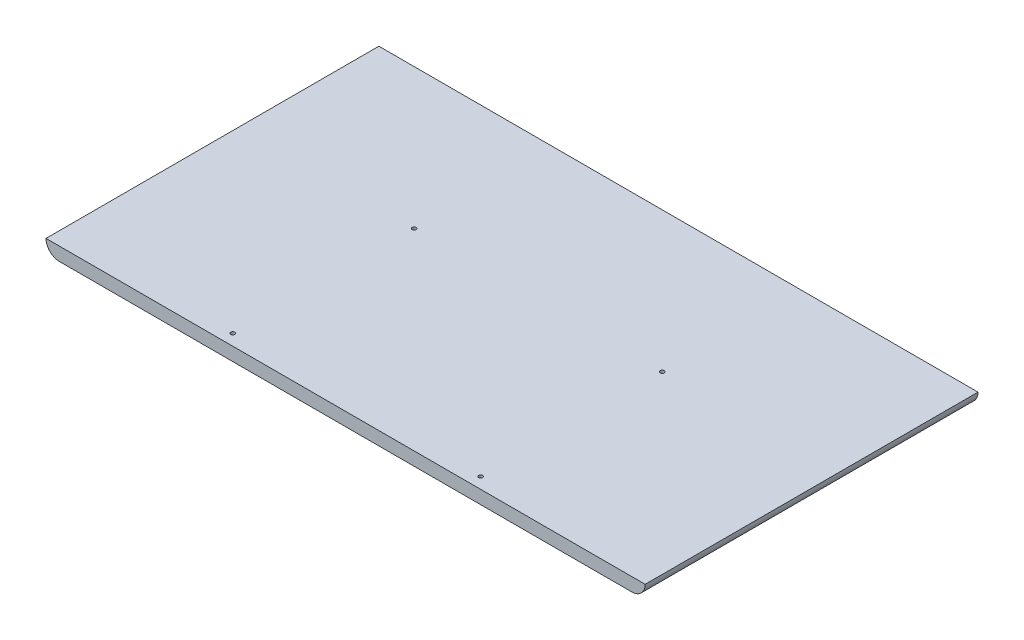
ISO-10303-21;
HEADER;
FILE_DESCRIPTION(('STEP AP214'),'2;1');
FILE_NAME('part.step','',(''),(''),'','','');
FILE_SCHEMA(('AUTOMOTIVE_DESIGN { 1 0 10303 214 1 1 1 1 }'));
ENDSEC;
DATA;
#1=APPLICATION_CONTEXT('core data for automotive mechanical design processes');
#2=APPLICATION_PROTOCOL_DEFINITION('international standard','automotive_design',2000,#1);
#3=PRODUCT_CONTEXT('',#1,'mechanical');
#4=PRODUCT('Part','Part','',(#3));
#5=PRODUCT_RELATED_PRODUCT_CATEGORY('part','',(#4));
#6=PRODUCT_DEFINITION_FORMATION('','',#4);
#7=PRODUCT_DEFINITION_CONTEXT('part definition',#1,'design');
#8=PRODUCT_DEFINITION('design','',#6,#7);
#9=PRODUCT_DEFINITION_SHAPE('','',#8);
#10=(LENGTH_UNIT() NAMED_UNIT(*) SI_UNIT(.MILLI.,.METRE.));
#11=(NAMED_UNIT(*) PLANE_ANGLE_UNIT() SI_UNIT($,.RADIAN.));
#12=(NAMED_UNIT(*) SI_UNIT($,.STERADIAN.) SOLID_ANGLE_UNIT());
#13=UNCERTAINTY_MEASURE_WITH_UNIT(LENGTH_MEASURE(1.E-05),#10,'distance_accuracy_value','');
#14=(GEOMETRIC_REPRESENTATION_CONTEXT(3) GLOBAL_UNCERTAINTY_ASSIGNED_CONTEXT((#13)) GLOBAL_UNIT_ASSIGNED_CONTEXT((#10,
#11,#12)) REPRESENTATION_CONTEXT('',''));
#15=CARTESIAN_POINT('',(0.,0.,0.));
#16=DIRECTION('',(0.,0.,1.));
#17=DIRECTION('',(1.,0.,0.));
#18=AXIS2_PLACEMENT_3D('',#15,#16,#17);
#19=CARTESIAN_POINT('',(435.039371405109,-0.471468239714629,250.));
#20=DIRECTION('',(0.,-1.,0.));
#21=DIRECTION('',(1.,0.,0.));
#22=AXIS2_PLACEMENT_3D('',#19,#20,#21);
#23=PLANE('',#22);
#24=CARTESIAN_POINT('',(303.189371405109,-0.471468239714645,105.35));
#25=DIRECTION('',(0.,1.,0.));
#26=DIRECTION('',(-1.,0.,0.));
#27=AXIS2_PLACEMENT_3D('',#24,#25,#26);
#28=CIRCLE('',#27,1.50000000000002);
#29=CARTESIAN_POINT('',(301.689371405109,-0.471468239714645,105.35));
#30=VERTEX_POINT('',#29);
#31=EDGE_CURVE('E116',#30,#30,#28,.T.);
#32=ORIENTED_EDGE('',*,*,#31,.F.);
#33=EDGE_LOOP('',(#32));
#34=FACE_BOUND('',#33,.T.);
#35=CARTESIAN_POINT('',(116.879371405109,-0.471468239714666,105.35));
#36=DIRECTION('',(0.,1.,0.));
#37=DIRECTION('',(-1.,0.,0.));
#38=AXIS2_PLACEMENT_3D('',#35,#36,#37);
#39=CIRCLE('',#38,1.5);
#40=CARTESIAN_POINT('',(115.379371405109,-0.471468239714666,105.35));
#41=VERTEX_POINT('',#40);
#42=EDGE_CURVE('E123',#41,#41,#39,.T.);
#43=ORIENTED_EDGE('',*,*,#42,.F.);
#44=EDGE_LOOP('',(#43));
#45=FACE_BOUND('',#44,.T.);
#46=CARTESIAN_POINT('',(116.879371405109,-0.471468239714666,241.66));
#47=DIRECTION('',(0.,1.,0.));
#48=DIRECTION('',(-1.,0.,0.));
#49=AXIS2_PLACEMENT_3D('',#46,#47,#48);
#50=CIRCLE('',#49,1.5);
#51=CARTESIAN_POINT('',(115.379371405109,-0.471468239714666,241.66));
#52=VERTEX_POINT('',#51);
#53=EDGE_CURVE('E129',#52,#52,#50,.T.);
#54=ORIENTED_EDGE('',*,*,#53,.F.);
#55=EDGE_LOOP('',(#54));
#56=FACE_BOUND('',#55,.T.);
#57=CARTESIAN_POINT('',(303.189371405109,-0.471468239714645,241.66));
#58=DIRECTION('',(0.,1.,0.));
#59=DIRECTION('',(-1.,0.,0.));
#60=AXIS2_PLACEMENT_3D('',#57,#58,#59);
#61=CIRCLE('',#60,1.50000000000002);
#62=CARTESIAN_POINT('',(301.689371405109,-0.471468239714645,241.66));
#63=VERTEX_POINT('',#62);
#64=EDGE_CURVE('E110',#63,#63,#61,.T.);
#65=ORIENTED_EDGE('',*,*,#64,.F.);
#66=EDGE_LOOP('',(#65));
#67=FACE_BOUND('',#66,.T.);
#68=DIRECTION('',(-1.,0.,0.));
#69=VECTOR('',#68,1.);
#70=CARTESIAN_POINT('',(435.039371405109,-0.471468239714629,0.));
#71=LINE('',#70,#69);
#72=CARTESIAN_POINT('',(435.039371405109,-0.471468239714629,0.));
#73=VERTEX_POINT('',#72);
#74=CARTESIAN_POINT('',(-14.960628594891,-0.471468239714681,0.));
#75=VERTEX_POINT('',#74);
#76=EDGE_CURVE('E106',#73,#75,#71,.T.);
#77=ORIENTED_EDGE('',*,*,#76,.T.);
#78=DIRECTION('',(0.,0.,-1.));
#79=VECTOR('',#78,1.);
#80=CARTESIAN_POINT('',(-14.960628594891,-0.471468239714681,250.));
#81=LINE('',#80,#79);
#82=CARTESIAN_POINT('',(-14.960628594891,-0.471468239714681,250.));
#83=VERTEX_POINT('',#82);
#84=EDGE_CURVE('E85',#83,#75,#81,.T.);
#85=ORIENTED_EDGE('',*,*,#84,.F.);
#86=DIRECTION('',(-1.,0.,0.));
#87=VECTOR('',#86,1.);
#88=CARTESIAN_POINT('',(435.039371405109,-0.471468239714629,250.));
#89=LINE('',#88,#87);
#90=CARTESIAN_POINT('',(435.039371405109,-0.471468239714629,250.));
#91=VERTEX_POINT('',#90);
#92=EDGE_CURVE('E75',#91,#83,#89,.T.);
#93=ORIENTED_EDGE('',*,*,#92,.F.);
#94=DIRECTION('',(0.,0.,-1.));
#95=VECTOR('',#94,1.);
#96=CARTESIAN_POINT('',(435.039371405109,-0.471468239714629,250.));
#97=LINE('',#96,#95);
#98=EDGE_CURVE('E83',#91,#73,#97,.T.);
#99=ORIENTED_EDGE('',*,*,#98,.T.);
#100=EDGE_LOOP('',(#77,#85,#93,#99));
#101=FACE_BOUND('',#100,.T.);
#102=ADVANCED_FACE('F33',(#34,#45,#56,#67,#101),#23,.F.);
#103=CARTESIAN_POINT('',(435.039371405109,-10.4714682397146,250.));
#104=DIRECTION('',(0.,1.,0.));
#105=DIRECTION('',(-1.,0.,0.));
#106=AXIS2_PLACEMENT_3D('',#103,#104,#105);
#107=PLANE('',#106);
#108=CARTESIAN_POINT('',(303.189371405109,-10.4714682397146,105.35));
#109=DIRECTION('',(0.,1.,0.));
#110=DIRECTION('',(-1.,0.,0.));
#111=AXIS2_PLACEMENT_3D('',#108,#109,#110);
#112=CIRCLE('',#111,1.50000000000002);
#113=CARTESIAN_POINT('',(301.689371405109,-10.4714682397146,105.35));
#114=VERTEX_POINT('',#113);
#115=EDGE_CURVE('E119',#114,#114,#112,.T.);
#116=ORIENTED_EDGE('',*,*,#115,.T.);
#117=EDGE_LOOP('',(#116));
#118=FACE_BOUND('',#117,.T.);
#119=CARTESIAN_POINT('',(116.879371405109,-10.4714682397147,105.35));
#120=DIRECTION('',(0.,1.,0.));
#121=DIRECTION('',(-1.,0.,0.));
#122=AXIS2_PLACEMENT_3D('',#119,#120,#121);
#123=CIRCLE('',#122,1.5);
#124=CARTESIAN_POINT('',(115.379371405109,-10.4714682397147,105.35));
#125=VERTEX_POINT('',#124);
#126=EDGE_CURVE('E126',#125,#125,#123,.T.);
#127=ORIENTED_EDGE('',*,*,#126,.T.);
#128=EDGE_LOOP('',(#127));
#129=FACE_BOUND('',#128,.T.);
#130=CARTESIAN_POINT('',(116.879371405109,-10.4714682397147,241.66));
#131=DIRECTION('',(0.,1.,0.));
#132=DIRECTION('',(-1.,0.,0.));
#133=AXIS2_PLACEMENT_3D('',#130,#131,#132);
#134=CIRCLE('',#133,1.5);
#135=CARTESIAN_POINT('',(115.379371405109,-10.4714682397147,241.66));
#136=VERTEX_POINT('',#135);
#137=EDGE_CURVE('E114',#136,#136,#134,.T.);
#138=ORIENTED_EDGE('',*,*,#137,.T.);
#139=EDGE_LOOP('',(#138));
#140=FACE_BOUND('',#139,.T.);
#141=CARTESIAN_POINT('',(303.189371405109,-10.4714682397146,241.66));
#142=DIRECTION('',(0.,1.,0.));
#143=DIRECTION('',(-1.,0.,0.));
#144=AXIS2_PLACEMENT_3D('',#141,#142,#143);
#145=CIRCLE('',#144,1.50000000000002);
#146=CARTESIAN_POINT('',(301.689371405109,-10.4714682397146,241.66));
#147=VERTEX_POINT('',#146);
#148=EDGE_CURVE('E107',#147,#147,#145,.T.);
#149=ORIENTED_EDGE('',*,*,#148,.T.);
#150=EDGE_LOOP('',(#149));
#151=FACE_BOUND('',#150,.T.);
#152=DIRECTION('',(1.,0.,0.));
#153=VECTOR('',#152,1.);
#154=CARTESIAN_POINT('',(435.039371405109,-10.4714682397146,0.));
#155=LINE('',#154,#153);
#156=CARTESIAN_POINT('',(-4.96062859489099,-10.4714682397147,0.));
#157=VERTEX_POINT('',#156);
#158=CARTESIAN_POINT('',(425.039371405109,-10.4714682397146,0.));
#159=VERTEX_POINT('',#158);
#160=EDGE_CURVE('E87',#157,#159,#155,.T.);
#161=ORIENTED_EDGE('',*,*,#160,.T.);
#162=DIRECTION('',(0.,0.,-1.));
#163=VECTOR('',#162,1.);
#164=CARTESIAN_POINT('',(425.039371405109,-10.4714682397146,250.));
#165=LINE('',#164,#163);
#166=CARTESIAN_POINT('',(425.039371405109,-10.4714682397146,250.));
#167=VERTEX_POINT('',#166);
#168=EDGE_CURVE('E41',#159,#167,#165,.F.);
#169=ORIENTED_EDGE('',*,*,#168,.T.);
#170=DIRECTION('',(1.,0.,0.));
#171=VECTOR('',#170,1.);
#172=CARTESIAN_POINT('',(435.039371405109,-10.4714682397146,250.));
#173=LINE('',#172,#171);
#174=CARTESIAN_POINT('',(-4.96062859489099,-10.4714682397147,250.));
#175=VERTEX_POINT('',#174);
#176=EDGE_CURVE('E77',#175,#167,#173,.T.);
#177=ORIENTED_EDGE('',*,*,#176,.F.);
#178=DIRECTION('',(0.,0.,-1.));
#179=VECTOR('',#178,1.);
#180=CARTESIAN_POINT('',(-4.96062859489099,-10.4714682397147,250.));
#181=LINE('',#180,#179);
#182=EDGE_CURVE('E89',#175,#157,#181,.T.);
#183=ORIENTED_EDGE('',*,*,#182,.T.);
#184=EDGE_LOOP('',(#161,#169,#177,#183));
#185=FACE_BOUND('',#184,.T.);
#186=ADVANCED_FACE('F102',(#118,#129,#140,#151,#185),#107,.F.);
#187=CARTESIAN_POINT('',(0.,0.,250.));
#188=DIRECTION('',(0.,0.,-1.));
#189=DIRECTION('',(-1.,0.,0.));
#190=AXIS2_PLACEMENT_3D('',#187,#188,#189);
#191=PLANE('',#190);
#192=ORIENTED_EDGE('',*,*,#176,.T.);
#193=CARTESIAN_POINT('',(425.039371405109,-0.471468239714629,250.));
#194=DIRECTION('',(0.,0.,-1.));
#195=DIRECTION('',(-1.,0.,0.));
#196=AXIS2_PLACEMENT_3D('',#193,#194,#195);
#197=CIRCLE('',#196,10.);
#198=EDGE_CURVE('E11',#167,#91,#197,.F.);
#199=ORIENTED_EDGE('',*,*,#198,.T.);
#200=ORIENTED_EDGE('',*,*,#92,.T.);
#201=CARTESIAN_POINT('',(-4.96062859489099,-0.47146823971468,250.));
#202=DIRECTION('',(0.,0.,-1.));
#203=DIRECTION('',(-1.,0.,0.));
#204=AXIS2_PLACEMENT_3D('',#201,#202,#203);
#205=CIRCLE('',#204,10.);
#206=EDGE_CURVE('E98',#83,#175,#205,.F.);
#207=ORIENTED_EDGE('',*,*,#206,.T.);
#208=EDGE_LOOP('',(#192,#199,#200,#207));
#209=FACE_BOUND('',#208,.T.);
#210=ADVANCED_FACE('F74',(#209),#191,.F.);
#211=CARTESIAN_POINT('',(0.,0.,0.));
#212=DIRECTION('',(0.,0.,-1.));
#213=DIRECTION('',(-1.,0.,0.));
#214=AXIS2_PLACEMENT_3D('',#211,#212,#213);
#215=PLANE('',#214);
#216=CARTESIAN_POINT('',(395.35310173914,-5.47146823971468,0.));
#217=DIRECTION('',(0.,0.,-1.));
#218=DIRECTION('',(-1.,0.,0.));
#219=AXIS2_PLACEMENT_3D('',#216,#217,#218);
#220=CIRCLE('',#219,1.50000000000002);
#221=CARTESIAN_POINT('',(393.85310173914,-5.47146823971468,0.));
#222=VERTEX_POINT('',#221);
#223=EDGE_CURVE('E146',#222,#222,#220,.T.);
#224=ORIENTED_EDGE('',*,*,#223,.F.);
#225=EDGE_LOOP('',(#224));
#226=FACE_BOUND('',#225,.T.);
#227=CARTESIAN_POINT('',(210.039371405109,-5.47146823971463,0.));
#228=DIRECTION('',(0.,0.,-1.));
#229=DIRECTION('',(-1.,0.,0.));
#230=AXIS2_PLACEMENT_3D('',#227,#228,#229);
#231=CIRCLE('',#230,1.5);
#232=CARTESIAN_POINT('',(208.539371405109,-5.47146823971463,0.));
#233=VERTEX_POINT('',#232);
#234=EDGE_CURVE('E140',#233,#233,#231,.T.);
#235=ORIENTED_EDGE('',*,*,#234,.F.);
#236=EDGE_LOOP('',(#235));
#237=FACE_BOUND('',#236,.T.);
#238=CARTESIAN_POINT('',(25.039371405109,-5.47146823971463,0.));
#239=DIRECTION('',(0.,0.,-1.));
#240=DIRECTION('',(-1.,0.,0.));
#241=AXIS2_PLACEMENT_3D('',#238,#239,#240);
#242=CIRCLE('',#241,1.5);
#243=CARTESIAN_POINT('',(23.539371405109,-5.47146823971463,0.));
#244=VERTEX_POINT('',#243);
#245=EDGE_CURVE('E134',#244,#244,#242,.T.);
#246=ORIENTED_EDGE('',*,*,#245,.F.);
#247=EDGE_LOOP('',(#246));
#248=FACE_BOUND('',#247,.T.);
#249=ORIENTED_EDGE('',*,*,#76,.F.);
#250=CARTESIAN_POINT('',(425.039371405109,-0.471468239714629,0.));
#251=DIRECTION('',(0.,0.,-1.));
#252=DIRECTION('',(-1.,0.,0.));
#253=AXIS2_PLACEMENT_3D('',#250,#251,#252);
#254=CIRCLE('',#253,10.);
#255=EDGE_CURVE('E55',#73,#159,#254,.T.);
#256=ORIENTED_EDGE('',*,*,#255,.T.);
#257=ORIENTED_EDGE('',*,*,#160,.F.);
#258=CARTESIAN_POINT('',(-4.96062859489099,-0.47146823971468,0.));
#259=DIRECTION('',(0.,0.,-1.));
#260=DIRECTION('',(-1.,0.,0.));
#261=AXIS2_PLACEMENT_3D('',#258,#259,#260);
#262=CIRCLE('',#261,10.);
#263=EDGE_CURVE('E92',#157,#75,#262,.T.);
#264=ORIENTED_EDGE('',*,*,#263,.T.);
#265=EDGE_LOOP('',(#249,#256,#257,#264));
#266=FACE_BOUND('',#265,.T.);
#267=ADVANCED_FACE('F105',(#226,#237,#248,#266),#215,.T.);
#268=CARTESIAN_POINT('',(-4.96062859489099,-0.47146823971468,250.));
#269=DIRECTION('',(0.,0.,-1.));
#270=DIRECTION('',(-1.,0.,0.));
#271=AXIS2_PLACEMENT_3D('',#268,#269,#270);
#272=CYLINDRICAL_SURFACE('',#271,10.);
#273=ORIENTED_EDGE('',*,*,#206,.F.);
#274=ORIENTED_EDGE('',*,*,#84,.T.);
#275=ORIENTED_EDGE('',*,*,#263,.F.);
#276=ORIENTED_EDGE('',*,*,#182,.F.);
#277=EDGE_LOOP('',(#273,#274,#275,#276));
#278=FACE_BOUND('',#277,.T.);
#279=ADVANCED_FACE('F104',(#278),#272,.T.);
#280=CARTESIAN_POINT('',(425.039371405109,-0.471468239714629,250.));
#281=DIRECTION('',(0.,0.,-1.));
#282=DIRECTION('',(-1.,0.,0.));
#283=AXIS2_PLACEMENT_3D('',#280,#281,#282);
#284=CYLINDRICAL_SURFACE('',#283,10.);
#285=ORIENTED_EDGE('',*,*,#198,.F.);
#286=ORIENTED_EDGE('',*,*,#168,.F.);
#287=ORIENTED_EDGE('',*,*,#255,.F.);
#288=ORIENTED_EDGE('',*,*,#98,.F.);
#289=EDGE_LOOP('',(#285,#286,#287,#288));
#290=FACE_BOUND('',#289,.T.);
#291=ADVANCED_FACE('F35',(#290),#284,.T.);
#292=CARTESIAN_POINT('',(303.189371405109,-10.4714682397146,241.66));
#293=DIRECTION('',(0.,1.,0.));
#294=DIRECTION('',(-1.,0.,0.));
#295=AXIS2_PLACEMENT_3D('',#292,#293,#294);
#296=CYLINDRICAL_SURFACE('',#295,1.50000000000002);
#297=ORIENTED_EDGE('',*,*,#148,.F.);
#298=EDGE_LOOP('',(#297));
#299=FACE_BOUND('',#298,.T.);
#300=ORIENTED_EDGE('',*,*,#64,.T.);
#301=EDGE_LOOP('',(#300));
#302=FACE_BOUND('',#301,.T.);
#303=ADVANCED_FACE('F200',(#299,#302),#296,.F.);
#304=CARTESIAN_POINT('',(116.879371405109,-10.4714682397147,241.66));
#305=DIRECTION('',(0.,1.,0.));
#306=DIRECTION('',(-1.,0.,0.));
#307=AXIS2_PLACEMENT_3D('',#304,#305,#306);
#308=CYLINDRICAL_SURFACE('',#307,1.5);
#309=ORIENTED_EDGE('',*,*,#137,.F.);
#310=EDGE_LOOP('',(#309));
#311=FACE_BOUND('',#310,.T.);
#312=ORIENTED_EDGE('',*,*,#53,.T.);
#313=EDGE_LOOP('',(#312));
#314=FACE_BOUND('',#313,.T.);
#315=ADVANCED_FACE('F204',(#311,#314),#308,.F.);
#316=CARTESIAN_POINT('',(116.879371405109,-10.4714682397147,105.35));
#317=DIRECTION('',(0.,1.,0.));
#318=DIRECTION('',(-1.,0.,0.));
#319=AXIS2_PLACEMENT_3D('',#316,#317,#318);
#320=CYLINDRICAL_SURFACE('',#319,1.5);
#321=ORIENTED_EDGE('',*,*,#126,.F.);
#322=EDGE_LOOP('',(#321));
#323=FACE_BOUND('',#322,.T.);
#324=ORIENTED_EDGE('',*,*,#42,.T.);
#325=EDGE_LOOP('',(#324));
#326=FACE_BOUND('',#325,.T.);
#327=ADVANCED_FACE('F181',(#323,#326),#320,.F.);
#328=CARTESIAN_POINT('',(303.189371405109,-10.4714682397146,105.35));
#329=DIRECTION('',(0.,1.,0.));
#330=DIRECTION('',(-1.,0.,0.));
#331=AXIS2_PLACEMENT_3D('',#328,#329,#330);
#332=CYLINDRICAL_SURFACE('',#331,1.50000000000002);
#333=ORIENTED_EDGE('',*,*,#115,.F.);
#334=EDGE_LOOP('',(#333));
#335=FACE_BOUND('',#334,.T.);
#336=ORIENTED_EDGE('',*,*,#31,.T.);
#337=EDGE_LOOP('',(#336));
#338=FACE_BOUND('',#337,.T.);
#339=ADVANCED_FACE('F171',(#335,#338),#332,.F.);
#340=CARTESIAN_POINT('',(25.039371405109,-5.47146823971463,20.));
#341=DIRECTION('',(0.,0.,-1.));
#342=DIRECTION('',(-1.,0.,0.));
#343=AXIS2_PLACEMENT_3D('',#340,#341,#342);
#344=CYLINDRICAL_SURFACE('',#343,1.5);
#345=CARTESIAN_POINT('',(25.039371405109,-5.47146823971463,20.));
#346=DIRECTION('',(0.,0.,-1.));
#347=DIRECTION('',(-1.,0.,0.));
#348=AXIS2_PLACEMENT_3D('',#345,#346,#347);
#349=CIRCLE('',#348,1.5);
#350=CARTESIAN_POINT('',(23.539371405109,-5.47146823971463,20.));
#351=VERTEX_POINT('',#350);
#352=EDGE_CURVE('E137',#351,#351,#349,.T.);
#353=ORIENTED_EDGE('',*,*,#352,.F.);
#354=EDGE_LOOP('',(#353));
#355=FACE_BOUND('',#354,.T.);
#356=ORIENTED_EDGE('',*,*,#245,.T.);
#357=EDGE_LOOP('',(#356));
#358=FACE_BOUND('',#357,.T.);
#359=ADVANCED_FACE('F168',(#355,#358),#344,.F.);
#360=CARTESIAN_POINT('',(25.039371405109,-5.47146823971463,20.));
#361=DIRECTION('',(0.,0.,-1.));
#362=DIRECTION('',(-1.,0.,0.));
#363=AXIS2_PLACEMENT_3D('',#360,#361,#362);
#364=PLANE('',#363);
#365=ORIENTED_EDGE('',*,*,#352,.T.);
#366=EDGE_LOOP('',(#365));
#367=FACE_BOUND('',#366,.T.);
#368=ADVANCED_FACE('F170',(#367),#364,.T.);
#369=CARTESIAN_POINT('',(210.039371405109,-5.47146823971463,20.));
#370=DIRECTION('',(0.,0.,-1.));
#371=DIRECTION('',(-1.,0.,0.));
#372=AXIS2_PLACEMENT_3D('',#369,#370,#371);
#373=CYLINDRICAL_SURFACE('',#372,1.5);
#374=CARTESIAN_POINT('',(210.039371405109,-5.47146823971463,20.));
#375=DIRECTION('',(0.,0.,-1.));
#376=DIRECTION('',(-1.,0.,0.));
#377=AXIS2_PLACEMENT_3D('',#374,#375,#376);
#378=CIRCLE('',#377,1.5);
#379=CARTESIAN_POINT('',(208.539371405109,-5.47146823971463,20.));
#380=VERTEX_POINT('',#379);
#381=EDGE_CURVE('E143',#380,#380,#378,.T.);
#382=ORIENTED_EDGE('',*,*,#381,.F.);
#383=EDGE_LOOP('',(#382));
#384=FACE_BOUND('',#383,.T.);
#385=ORIENTED_EDGE('',*,*,#234,.T.);
#386=EDGE_LOOP('',(#385));
#387=FACE_BOUND('',#386,.T.);
#388=ADVANCED_FACE('F178',(#384,#387),#373,.F.);
#389=CARTESIAN_POINT('',(210.039371405109,-5.47146823971463,20.));
#390=DIRECTION('',(0.,0.,-1.));
#391=DIRECTION('',(-1.,0.,0.));
#392=AXIS2_PLACEMENT_3D('',#389,#390,#391);
#393=PLANE('',#392);
#394=ORIENTED_EDGE('',*,*,#381,.T.);
#395=EDGE_LOOP('',(#394));
#396=FACE_BOUND('',#395,.T.);
#397=ADVANCED_FACE('F157',(#396),#393,.T.);
#398=CARTESIAN_POINT('',(395.35310173914,-5.47146823971468,20.));
#399=DIRECTION('',(0.,0.,-1.));
#400=DIRECTION('',(-1.,0.,0.));
#401=AXIS2_PLACEMENT_3D('',#398,#399,#400);
#402=CYLINDRICAL_SURFACE('',#401,1.50000000000002);
#403=CARTESIAN_POINT('',(395.35310173914,-5.47146823971468,20.));
#404=DIRECTION('',(0.,0.,-1.));
#405=DIRECTION('',(-1.,0.,0.));
#406=AXIS2_PLACEMENT_3D('',#403,#404,#405);
#407=CIRCLE('',#406,1.50000000000002);
#408=CARTESIAN_POINT('',(393.85310173914,-5.47146823971468,20.));
#409=VERTEX_POINT('',#408);
#410=EDGE_CURVE('E120',#409,#409,#407,.T.);
#411=ORIENTED_EDGE('',*,*,#410,.F.);
#412=EDGE_LOOP('',(#411));
#413=FACE_BOUND('',#412,.T.);
#414=ORIENTED_EDGE('',*,*,#223,.T.);
#415=EDGE_LOOP('',(#414));
#416=FACE_BOUND('',#415,.T.);
#417=ADVANCED_FACE('F154',(#413,#416),#402,.F.);
#418=CARTESIAN_POINT('',(395.35310173914,-5.47146823971468,20.));
#419=DIRECTION('',(0.,0.,-1.));
#420=DIRECTION('',(-1.,0.,0.));
#421=AXIS2_PLACEMENT_3D('',#418,#419,#420);
#422=PLANE('',#421);
#423=ORIENTED_EDGE('',*,*,#410,.T.);
#424=EDGE_LOOP('',(#423));
#425=FACE_BOUND('',#424,.T.);
#426=ADVANCED_FACE('F152',(#425),#422,.T.);
#427=CLOSED_SHELL('',(#102,#186,#210,#267,#279,#291,#303,#315,#327,#339,#359,#368,#388,#397,
#417,#426));
#428=MANIFOLD_SOLID_BREP('B2',#427);
#429=ADVANCED_BREP_SHAPE_REPRESENTATION('',(#18,#428),#14);
#430=SHAPE_DEFINITION_REPRESENTATION(#9,#429);
ENDSEC;
END-ISO-10303-21;
